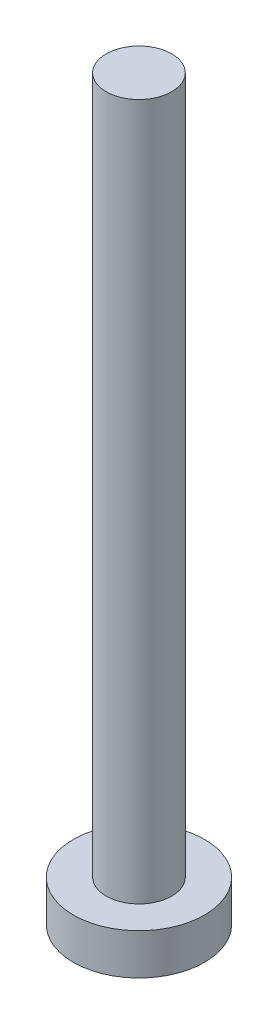
ISO-10303-21;
HEADER;
FILE_DESCRIPTION(('STEP AP214'),'2;1');
FILE_NAME('part.step','',(''),(''),'','','');
FILE_SCHEMA(('AUTOMOTIVE_DESIGN { 1 0 10303 214 1 1 1 1 }'));
ENDSEC;
DATA;
#1=APPLICATION_CONTEXT('core data for automotive mechanical design processes');
#2=APPLICATION_PROTOCOL_DEFINITION('international standard','automotive_design',2000,#1);
#3=PRODUCT_CONTEXT('',#1,'mechanical');
#4=PRODUCT('Part','Part','',(#3));
#5=PRODUCT_RELATED_PRODUCT_CATEGORY('part','',(#4));
#6=PRODUCT_DEFINITION_FORMATION('','',#4);
#7=PRODUCT_DEFINITION_CONTEXT('part definition',#1,'design');
#8=PRODUCT_DEFINITION('design','',#6,#7);
#9=PRODUCT_DEFINITION_SHAPE('','',#8);
#10=(LENGTH_UNIT() NAMED_UNIT(*) SI_UNIT(.MILLI.,.METRE.));
#11=(NAMED_UNIT(*) PLANE_ANGLE_UNIT() SI_UNIT($,.RADIAN.));
#12=(NAMED_UNIT(*) SI_UNIT($,.STERADIAN.) SOLID_ANGLE_UNIT());
#13=UNCERTAINTY_MEASURE_WITH_UNIT(LENGTH_MEASURE(1.E-05),#10,'distance_accuracy_value','');
#14=(GEOMETRIC_REPRESENTATION_CONTEXT(3) GLOBAL_UNCERTAINTY_ASSIGNED_CONTEXT((#13)) GLOBAL_UNIT_ASSIGNED_CONTEXT((#10,
#11,#12)) REPRESENTATION_CONTEXT('',''));
#15=CARTESIAN_POINT('',(0.,0.,0.));
#16=DIRECTION('',(0.,0.,1.));
#17=DIRECTION('',(1.,0.,0.));
#18=AXIS2_PLACEMENT_3D('',#15,#16,#17);
#19=CARTESIAN_POINT('',(0.,42.5,3.99999999999999));
#20=DIRECTION('',(0.,1.,0.));
#21=DIRECTION('',(0.,0.,1.));
#22=AXIS2_PLACEMENT_3D('',#19,#20,#21);
#23=PLANE('',#22);
#24=CARTESIAN_POINT('',(0.,42.5,0.));
#25=DIRECTION('',(0.,1.,0.));
#26=DIRECTION('',(0.,0.,1.));
#27=AXIS2_PLACEMENT_3D('',#24,#25,#26);
#28=CIRCLE('',#27,3.99999999999999);
#29=CARTESIAN_POINT('',(0.,42.5,3.99999999999999));
#30=VERTEX_POINT('',#29);
#31=EDGE_CURVE('E187',#30,#30,#28,.T.);
#32=ORIENTED_EDGE('',*,*,#31,.T.);
#33=EDGE_LOOP('',(#32));
#34=FACE_BOUND('',#33,.T.);
#35=ADVANCED_FACE('F33',(#34),#23,.T.);
#36=CARTESIAN_POINT('',(0.,-47.5,7.99999999999999));
#37=DIRECTION('',(0.,-1.,0.));
#38=DIRECTION('',(0.,0.,-1.));
#39=AXIS2_PLACEMENT_3D('',#36,#37,#38);
#40=PLANE('',#39);
#41=DIRECTION('',(1.,0.,0.));
#42=VECTOR('',#41,1.);
#43=CARTESIAN_POINT('',(0.,-47.5,-0.999999999999999));
#44=LINE('',#43,#42);
#45=CARTESIAN_POINT('',(-5.,-47.5,-0.999999999999998));
#46=VERTEX_POINT('',#45);
#47=CARTESIAN_POINT('',(-0.999999999999999,-47.5,-0.999999999999997));
#48=VERTEX_POINT('',#47);
#49=EDGE_CURVE('E47',#46,#48,#44,.T.);
#50=ORIENTED_EDGE('',*,*,#49,.F.);
#51=DIRECTION('',(0.,0.,-1.));
#52=VECTOR('',#51,1.);
#53=CARTESIAN_POINT('',(-5.,-47.5,0.));
#54=LINE('',#53,#52);
#55=CARTESIAN_POINT('',(-5.,-47.5,1.));
#56=VERTEX_POINT('',#55);
#57=EDGE_CURVE('E183',#56,#46,#54,.T.);
#58=ORIENTED_EDGE('',*,*,#57,.F.);
#59=DIRECTION('',(1.,0.,0.));
#60=VECTOR('',#59,1.);
#61=CARTESIAN_POINT('',(0.,-47.5,1.));
#62=LINE('',#61,#60);
#63=CARTESIAN_POINT('',(-0.999999999999999,-47.5,1.));
#64=VERTEX_POINT('',#63);
#65=EDGE_CURVE('E181',#56,#64,#62,.T.);
#66=ORIENTED_EDGE('',*,*,#65,.T.);
#67=DIRECTION('',(0.,0.,-1.));
#68=VECTOR('',#67,1.);
#69=CARTESIAN_POINT('',(-0.999999999999999,-47.5,0.));
#70=LINE('',#69,#68);
#71=CARTESIAN_POINT('',(-1.,-47.5,5.));
#72=VERTEX_POINT('',#71);
#73=EDGE_CURVE('E140',#72,#64,#70,.T.);
#74=ORIENTED_EDGE('',*,*,#73,.F.);
#75=DIRECTION('',(1.,0.,0.));
#76=VECTOR('',#75,1.);
#77=CARTESIAN_POINT('',(0.,-47.5,5.));
#78=LINE('',#77,#76);
#79=CARTESIAN_POINT('',(1.,-47.5,5.));
#80=VERTEX_POINT('',#79);
#81=EDGE_CURVE('E177',#72,#80,#78,.T.);
#82=ORIENTED_EDGE('',*,*,#81,.T.);
#83=DIRECTION('',(0.,0.,-1.));
#84=VECTOR('',#83,1.);
#85=CARTESIAN_POINT('',(1.,-47.5,0.));
#86=LINE('',#85,#84);
#87=CARTESIAN_POINT('',(1.,-47.5,1.));
#88=VERTEX_POINT('',#87);
#89=EDGE_CURVE('E174',#80,#88,#86,.T.);
#90=ORIENTED_EDGE('',*,*,#89,.T.);
#91=DIRECTION('',(1.,0.,0.));
#92=VECTOR('',#91,1.);
#93=CARTESIAN_POINT('',(0.,-47.5,1.));
#94=LINE('',#93,#92);
#95=CARTESIAN_POINT('',(5.,-47.5,1.));
#96=VERTEX_POINT('',#95);
#97=EDGE_CURVE('E171',#88,#96,#94,.T.);
#98=ORIENTED_EDGE('',*,*,#97,.T.);
#99=DIRECTION('',(0.,0.,-1.));
#100=VECTOR('',#99,1.);
#101=CARTESIAN_POINT('',(5.,-47.5,0.));
#102=LINE('',#101,#100);
#103=CARTESIAN_POINT('',(5.,-47.5,-0.999999999999998));
#104=VERTEX_POINT('',#103);
#105=EDGE_CURVE('E168',#96,#104,#102,.T.);
#106=ORIENTED_EDGE('',*,*,#105,.T.);
#107=DIRECTION('',(1.,0.,0.));
#108=VECTOR('',#107,1.);
#109=CARTESIAN_POINT('',(0.,-47.5,-0.999999999999998));
#110=LINE('',#109,#108);
#111=CARTESIAN_POINT('',(1.,-47.5,-0.999999999999998));
#112=VERTEX_POINT('',#111);
#113=EDGE_CURVE('E165',#112,#104,#110,.T.);
#114=ORIENTED_EDGE('',*,*,#113,.F.);
#115=DIRECTION('',(0.,0.,-1.));
#116=VECTOR('',#115,1.);
#117=CARTESIAN_POINT('',(1.,-47.5,0.));
#118=LINE('',#117,#116);
#119=CARTESIAN_POINT('',(1.,-47.5,-5.));
#120=VERTEX_POINT('',#119);
#121=EDGE_CURVE('E162',#112,#120,#118,.T.);
#122=ORIENTED_EDGE('',*,*,#121,.T.);
#123=DIRECTION('',(1.,0.,0.));
#124=VECTOR('',#123,1.);
#125=CARTESIAN_POINT('',(0.,-47.5,-5.));
#126=LINE('',#125,#124);
#127=CARTESIAN_POINT('',(-0.999999999999998,-47.5,-5.));
#128=VERTEX_POINT('',#127);
#129=EDGE_CURVE('E159',#128,#120,#126,.T.);
#130=ORIENTED_EDGE('',*,*,#129,.F.);
#131=DIRECTION('',(0.,0.,-1.));
#132=VECTOR('',#131,1.);
#133=CARTESIAN_POINT('',(-0.999999999999999,-47.5,0.));
#134=LINE('',#133,#132);
#135=EDGE_CURVE('E156',#48,#128,#134,.T.);
#136=ORIENTED_EDGE('',*,*,#135,.F.);
#137=EDGE_LOOP('',(#50,#58,#66,#74,#82,#90,#98,#106,#114,#122,#130,#136));
#138=FACE_BOUND('',#137,.T.);
#139=CARTESIAN_POINT('',(0.,-47.5,0.));
#140=DIRECTION('',(0.,1.,0.));
#141=DIRECTION('',(0.,0.,1.));
#142=AXIS2_PLACEMENT_3D('',#139,#140,#141);
#143=CIRCLE('',#142,7.99999999999999);
#144=CARTESIAN_POINT('',(0.,-47.5,7.99999999999999));
#145=VERTEX_POINT('',#144);
#146=EDGE_CURVE('E11',#145,#145,#143,.T.);
#147=ORIENTED_EDGE('',*,*,#146,.F.);
#148=EDGE_LOOP('',(#147));
#149=FACE_BOUND('',#148,.T.);
#150=ADVANCED_FACE('F217',(#138,#149),#40,.T.);
#151=CARTESIAN_POINT('',(0.,13.7456465212145,0.));
#152=DIRECTION('',(0.,1.,0.));
#153=DIRECTION('',(0.,0.,1.));
#154=AXIS2_PLACEMENT_3D('',#151,#152,#153);
#155=CYLINDRICAL_SURFACE('',#154,7.99999999999999);
#156=ORIENTED_EDGE('',*,*,#146,.T.);
#157=EDGE_LOOP('',(#156));
#158=FACE_BOUND('',#157,.T.);
#159=CARTESIAN_POINT('',(0.,-42.5,0.));
#160=DIRECTION('',(0.,1.,0.));
#161=DIRECTION('',(0.,0.,1.));
#162=AXIS2_PLACEMENT_3D('',#159,#160,#161);
#163=CIRCLE('',#162,7.99999999999999);
#164=CARTESIAN_POINT('',(0.,-42.5,7.99999999999999));
#165=VERTEX_POINT('',#164);
#166=EDGE_CURVE('E40',#165,#165,#163,.T.);
#167=ORIENTED_EDGE('',*,*,#166,.F.);
#168=EDGE_LOOP('',(#167));
#169=FACE_BOUND('',#168,.T.);
#170=ADVANCED_FACE('F215',(#158,#169),#155,.T.);
#171=CARTESIAN_POINT('',(0.,-42.5,3.99999999999999));
#172=DIRECTION('',(0.,1.,0.));
#173=DIRECTION('',(0.,0.,1.));
#174=AXIS2_PLACEMENT_3D('',#171,#172,#173);
#175=PLANE('',#174);
#176=ORIENTED_EDGE('',*,*,#166,.T.);
#177=EDGE_LOOP('',(#176));
#178=FACE_BOUND('',#177,.T.);
#179=CARTESIAN_POINT('',(0.,-42.5,0.));
#180=DIRECTION('',(0.,1.,0.));
#181=DIRECTION('',(0.,0.,1.));
#182=AXIS2_PLACEMENT_3D('',#179,#180,#181);
#183=CIRCLE('',#182,3.99999999999999);
#184=CARTESIAN_POINT('',(0.,-42.5,3.99999999999999));
#185=VERTEX_POINT('',#184);
#186=EDGE_CURVE('E207',#185,#185,#183,.T.);
#187=ORIENTED_EDGE('',*,*,#186,.F.);
#188=EDGE_LOOP('',(#187));
#189=FACE_BOUND('',#188,.T.);
#190=ADVANCED_FACE('F212',(#178,#189),#175,.T.);
#191=CARTESIAN_POINT('',(0.,13.7456465212145,0.));
#192=DIRECTION('',(0.,1.,0.));
#193=DIRECTION('',(0.,0.,1.));
#194=AXIS2_PLACEMENT_3D('',#191,#192,#193);
#195=CYLINDRICAL_SURFACE('',#194,3.99999999999999);
#196=ORIENTED_EDGE('',*,*,#186,.T.);
#197=EDGE_LOOP('',(#196));
#198=FACE_BOUND('',#197,.T.);
#199=ORIENTED_EDGE('',*,*,#31,.F.);
#200=EDGE_LOOP('',(#199));
#201=FACE_BOUND('',#200,.T.);
#202=ADVANCED_FACE('F224',(#198,#201),#195,.T.);
#203=CARTESIAN_POINT('',(0.,-45.5,-0.999999999999999));
#204=DIRECTION('',(0.,0.,-1.));
#205=DIRECTION('',(-1.,0.,0.));
#206=AXIS2_PLACEMENT_3D('',#203,#204,#205);
#207=PLANE('',#206);
#208=ORIENTED_EDGE('',*,*,#49,.T.);
#209=DIRECTION('',(0.,-1.,0.));
#210=VECTOR('',#209,1.);
#211=CARTESIAN_POINT('',(-0.999999999999999,-45.5,-0.999999999999999));
#212=LINE('',#211,#210);
#213=CARTESIAN_POINT('',(-0.999999999999999,-45.5,-0.999999999999999));
#214=VERTEX_POINT('',#213);
#215=EDGE_CURVE('E95',#214,#48,#212,.T.);
#216=ORIENTED_EDGE('',*,*,#215,.F.);
#217=DIRECTION('',(1.,0.,0.));
#218=VECTOR('',#217,1.);
#219=CARTESIAN_POINT('',(0.,-45.5,-0.999999999999999));
#220=LINE('',#219,#218);
#221=CARTESIAN_POINT('',(-5.,-45.5,-0.999999999999998));
#222=VERTEX_POINT('',#221);
#223=EDGE_CURVE('E185',#222,#214,#220,.T.);
#224=ORIENTED_EDGE('',*,*,#223,.F.);
#225=DIRECTION('',(0.,-1.,0.));
#226=VECTOR('',#225,1.);
#227=CARTESIAN_POINT('',(-5.,-45.5,-0.999999999999998));
#228=LINE('',#227,#226);
#229=EDGE_CURVE('E55',#222,#46,#228,.T.);
#230=ORIENTED_EDGE('',*,*,#229,.T.);
#231=EDGE_LOOP('',(#208,#216,#224,#230));
#232=FACE_BOUND('',#231,.T.);
#233=ADVANCED_FACE('F234',(#232),#207,.F.);
#234=CARTESIAN_POINT('',(-5.,-45.5,0.));
#235=DIRECTION('',(-1.,0.,0.));
#236=DIRECTION('',(0.,0.,1.));
#237=AXIS2_PLACEMENT_3D('',#234,#235,#236);
#238=PLANE('',#237);
#239=ORIENTED_EDGE('',*,*,#57,.T.);
#240=ORIENTED_EDGE('',*,*,#229,.F.);
#241=DIRECTION('',(0.,0.,-1.));
#242=VECTOR('',#241,1.);
#243=CARTESIAN_POINT('',(-5.,-45.5,0.));
#244=LINE('',#243,#242);
#245=CARTESIAN_POINT('',(-5.,-45.5,1.));
#246=VERTEX_POINT('',#245);
#247=EDGE_CURVE('E133',#246,#222,#244,.T.);
#248=ORIENTED_EDGE('',*,*,#247,.F.);
#249=DIRECTION('',(0.,-1.,0.));
#250=VECTOR('',#249,1.);
#251=CARTESIAN_POINT('',(-5.,-45.5,1.));
#252=LINE('',#251,#250);
#253=EDGE_CURVE('E129',#246,#56,#252,.T.);
#254=ORIENTED_EDGE('',*,*,#253,.T.);
#255=EDGE_LOOP('',(#239,#240,#248,#254));
#256=FACE_BOUND('',#255,.T.);
#257=ADVANCED_FACE('F240',(#256),#238,.F.);
#258=CARTESIAN_POINT('',(0.,-45.5,1.));
#259=DIRECTION('',(0.,0.,-1.));
#260=DIRECTION('',(-1.,0.,0.));
#261=AXIS2_PLACEMENT_3D('',#258,#259,#260);
#262=PLANE('',#261);
#263=ORIENTED_EDGE('',*,*,#65,.F.);
#264=ORIENTED_EDGE('',*,*,#253,.F.);
#265=DIRECTION('',(1.,0.,0.));
#266=VECTOR('',#265,1.);
#267=CARTESIAN_POINT('',(0.,-45.5,1.));
#268=LINE('',#267,#266);
#269=CARTESIAN_POINT('',(-0.999999999999999,-45.5,1.));
#270=VERTEX_POINT('',#269);
#271=EDGE_CURVE('E123',#246,#270,#268,.T.);
#272=ORIENTED_EDGE('',*,*,#271,.T.);
#273=DIRECTION('',(0.,-1.,0.));
#274=VECTOR('',#273,1.);
#275=CARTESIAN_POINT('',(-0.999999999999999,-45.5,1.));
#276=LINE('',#275,#274);
#277=EDGE_CURVE('E127',#270,#64,#276,.T.);
#278=ORIENTED_EDGE('',*,*,#277,.T.);
#279=EDGE_LOOP('',(#263,#264,#272,#278));
#280=FACE_BOUND('',#279,.T.);
#281=ADVANCED_FACE('F126',(#280),#262,.T.);
#282=CARTESIAN_POINT('',(-0.999999999999999,-45.5,0.));
#283=DIRECTION('',(-1.,0.,0.));
#284=DIRECTION('',(0.,0.,1.));
#285=AXIS2_PLACEMENT_3D('',#282,#283,#284);
#286=PLANE('',#285);
#287=ORIENTED_EDGE('',*,*,#73,.T.);
#288=ORIENTED_EDGE('',*,*,#277,.F.);
#289=DIRECTION('',(0.,0.,-1.));
#290=VECTOR('',#289,1.);
#291=CARTESIAN_POINT('',(-0.999999999999999,-45.5,0.));
#292=LINE('',#291,#290);
#293=CARTESIAN_POINT('',(-1.,-45.5,5.));
#294=VERTEX_POINT('',#293);
#295=EDGE_CURVE('E134',#294,#270,#292,.T.);
#296=ORIENTED_EDGE('',*,*,#295,.F.);
#297=DIRECTION('',(0.,-1.,0.));
#298=VECTOR('',#297,1.);
#299=CARTESIAN_POINT('',(-1.,-45.5,5.));
#300=LINE('',#299,#298);
#301=EDGE_CURVE('E142',#294,#72,#300,.T.);
#302=ORIENTED_EDGE('',*,*,#301,.T.);
#303=EDGE_LOOP('',(#287,#288,#296,#302));
#304=FACE_BOUND('',#303,.T.);
#305=ADVANCED_FACE('F138',(#304),#286,.F.);
#306=CARTESIAN_POINT('',(0.,-45.5,5.));
#307=DIRECTION('',(0.,0.,-1.));
#308=DIRECTION('',(-1.,0.,0.));
#309=AXIS2_PLACEMENT_3D('',#306,#307,#308);
#310=PLANE('',#309);
#311=ORIENTED_EDGE('',*,*,#81,.F.);
#312=ORIENTED_EDGE('',*,*,#301,.F.);
#313=DIRECTION('',(1.,0.,0.));
#314=VECTOR('',#313,1.);
#315=CARTESIAN_POINT('',(0.,-45.5,5.));
#316=LINE('',#315,#314);
#317=CARTESIAN_POINT('',(1.,-45.5,5.));
#318=VERTEX_POINT('',#317);
#319=EDGE_CURVE('E148',#294,#318,#316,.T.);
#320=ORIENTED_EDGE('',*,*,#319,.T.);
#321=DIRECTION('',(0.,-1.,0.));
#322=VECTOR('',#321,1.);
#323=CARTESIAN_POINT('',(1.,-45.5,5.));
#324=LINE('',#323,#322);
#325=EDGE_CURVE('E190',#318,#80,#324,.T.);
#326=ORIENTED_EDGE('',*,*,#325,.T.);
#327=EDGE_LOOP('',(#311,#312,#320,#326));
#328=FACE_BOUND('',#327,.T.);
#329=ADVANCED_FACE('F270',(#328),#310,.T.);
#330=CARTESIAN_POINT('',(1.,-45.5,0.));
#331=DIRECTION('',(-1.,0.,0.));
#332=DIRECTION('',(0.,0.,1.));
#333=AXIS2_PLACEMENT_3D('',#330,#331,#332);
#334=PLANE('',#333);
#335=ORIENTED_EDGE('',*,*,#89,.F.);
#336=ORIENTED_EDGE('',*,*,#325,.F.);
#337=DIRECTION('',(0.,0.,-1.));
#338=VECTOR('',#337,1.);
#339=CARTESIAN_POINT('',(1.,-45.5,0.));
#340=LINE('',#339,#338);
#341=CARTESIAN_POINT('',(1.,-45.5,1.));
#342=VERTEX_POINT('',#341);
#343=EDGE_CURVE('E150',#318,#342,#340,.T.);
#344=ORIENTED_EDGE('',*,*,#343,.T.);
#345=DIRECTION('',(0.,-1.,0.));
#346=VECTOR('',#345,1.);
#347=CARTESIAN_POINT('',(1.,-45.5,1.));
#348=LINE('',#347,#346);
#349=EDGE_CURVE('E192',#342,#88,#348,.T.);
#350=ORIENTED_EDGE('',*,*,#349,.T.);
#351=EDGE_LOOP('',(#335,#336,#344,#350));
#352=FACE_BOUND('',#351,.T.);
#353=ADVANCED_FACE('F266',(#352),#334,.T.);
#354=CARTESIAN_POINT('',(0.,-45.5,1.));
#355=DIRECTION('',(0.,0.,-1.));
#356=DIRECTION('',(-1.,0.,0.));
#357=AXIS2_PLACEMENT_3D('',#354,#355,#356);
#358=PLANE('',#357);
#359=ORIENTED_EDGE('',*,*,#97,.F.);
#360=ORIENTED_EDGE('',*,*,#349,.F.);
#361=DIRECTION('',(1.,0.,0.));
#362=VECTOR('',#361,1.);
#363=CARTESIAN_POINT('',(0.,-45.5,1.));
#364=LINE('',#363,#362);
#365=CARTESIAN_POINT('',(5.,-45.5,1.));
#366=VERTEX_POINT('',#365);
#367=EDGE_CURVE('E404',#342,#366,#364,.T.);
#368=ORIENTED_EDGE('',*,*,#367,.T.);
#369=DIRECTION('',(0.,-1.,0.));
#370=VECTOR('',#369,1.);
#371=CARTESIAN_POINT('',(5.,-45.5,1.));
#372=LINE('',#371,#370);
#373=EDGE_CURVE('E194',#366,#96,#372,.T.);
#374=ORIENTED_EDGE('',*,*,#373,.T.);
#375=EDGE_LOOP('',(#359,#360,#368,#374));
#376=FACE_BOUND('',#375,.T.);
#377=ADVANCED_FACE('F262',(#376),#358,.T.);
#378=CARTESIAN_POINT('',(5.,-45.5,0.));
#379=DIRECTION('',(-1.,0.,0.));
#380=DIRECTION('',(0.,0.,1.));
#381=AXIS2_PLACEMENT_3D('',#378,#379,#380);
#382=PLANE('',#381);
#383=ORIENTED_EDGE('',*,*,#105,.F.);
#384=ORIENTED_EDGE('',*,*,#373,.F.);
#385=DIRECTION('',(0.,0.,-1.));
#386=VECTOR('',#385,1.);
#387=CARTESIAN_POINT('',(5.,-45.5,0.));
#388=LINE('',#387,#386);
#389=CARTESIAN_POINT('',(5.,-45.5,-0.999999999999998));
#390=VERTEX_POINT('',#389);
#391=EDGE_CURVE('E402',#366,#390,#388,.T.);
#392=ORIENTED_EDGE('',*,*,#391,.T.);
#393=DIRECTION('',(0.,-1.,0.));
#394=VECTOR('',#393,1.);
#395=CARTESIAN_POINT('',(5.,-45.5,-0.999999999999998));
#396=LINE('',#395,#394);
#397=EDGE_CURVE('E196',#390,#104,#396,.T.);
#398=ORIENTED_EDGE('',*,*,#397,.T.);
#399=EDGE_LOOP('',(#383,#384,#392,#398));
#400=FACE_BOUND('',#399,.T.);
#401=ADVANCED_FACE('F258',(#400),#382,.T.);
#402=CARTESIAN_POINT('',(0.,-45.5,-0.999999999999998));
#403=DIRECTION('',(0.,0.,-1.));
#404=DIRECTION('',(-1.,0.,0.));
#405=AXIS2_PLACEMENT_3D('',#402,#403,#404);
#406=PLANE('',#405);
#407=ORIENTED_EDGE('',*,*,#113,.T.);
#408=ORIENTED_EDGE('',*,*,#397,.F.);
#409=DIRECTION('',(1.,0.,0.));
#410=VECTOR('',#409,1.);
#411=CARTESIAN_POINT('',(0.,-45.5,-0.999999999999998));
#412=LINE('',#411,#410);
#413=CARTESIAN_POINT('',(1.,-45.5,-0.999999999999998));
#414=VERTEX_POINT('',#413);
#415=EDGE_CURVE('E399',#414,#390,#412,.T.);
#416=ORIENTED_EDGE('',*,*,#415,.F.);
#417=DIRECTION('',(0.,-1.,0.));
#418=VECTOR('',#417,1.);
#419=CARTESIAN_POINT('',(1.,-45.5,-0.999999999999998));
#420=LINE('',#419,#418);
#421=EDGE_CURVE('E198',#414,#112,#420,.T.);
#422=ORIENTED_EDGE('',*,*,#421,.T.);
#423=EDGE_LOOP('',(#407,#408,#416,#422));
#424=FACE_BOUND('',#423,.T.);
#425=ADVANCED_FACE('F254',(#424),#406,.F.);
#426=CARTESIAN_POINT('',(1.,-45.5,0.));
#427=DIRECTION('',(-1.,0.,0.));
#428=DIRECTION('',(0.,0.,1.));
#429=AXIS2_PLACEMENT_3D('',#426,#427,#428);
#430=PLANE('',#429);
#431=ORIENTED_EDGE('',*,*,#121,.F.);
#432=ORIENTED_EDGE('',*,*,#421,.F.);
#433=DIRECTION('',(0.,0.,-1.));
#434=VECTOR('',#433,1.);
#435=CARTESIAN_POINT('',(1.,-45.5,0.));
#436=LINE('',#435,#434);
#437=CARTESIAN_POINT('',(1.,-45.5,-5.));
#438=VERTEX_POINT('',#437);
#439=EDGE_CURVE('E397',#414,#438,#436,.T.);
#440=ORIENTED_EDGE('',*,*,#439,.T.);
#441=DIRECTION('',(0.,-1.,0.));
#442=VECTOR('',#441,1.);
#443=CARTESIAN_POINT('',(1.,-45.5,-5.));
#444=LINE('',#443,#442);
#445=EDGE_CURVE('E200',#438,#120,#444,.T.);
#446=ORIENTED_EDGE('',*,*,#445,.T.);
#447=EDGE_LOOP('',(#431,#432,#440,#446));
#448=FACE_BOUND('',#447,.T.);
#449=ADVANCED_FACE('F250',(#448),#430,.T.);
#450=CARTESIAN_POINT('',(0.,-45.5,-5.));
#451=DIRECTION('',(0.,0.,-1.));
#452=DIRECTION('',(-1.,0.,0.));
#453=AXIS2_PLACEMENT_3D('',#450,#451,#452);
#454=PLANE('',#453);
#455=ORIENTED_EDGE('',*,*,#129,.T.);
#456=ORIENTED_EDGE('',*,*,#445,.F.);
#457=DIRECTION('',(1.,0.,0.));
#458=VECTOR('',#457,1.);
#459=CARTESIAN_POINT('',(0.,-45.5,-5.));
#460=LINE('',#459,#458);
#461=CARTESIAN_POINT('',(-0.999999999999998,-45.5,-5.));
#462=VERTEX_POINT('',#461);
#463=EDGE_CURVE('E392',#462,#438,#460,.T.);
#464=ORIENTED_EDGE('',*,*,#463,.F.);
#465=DIRECTION('',(0.,-1.,0.));
#466=VECTOR('',#465,1.);
#467=CARTESIAN_POINT('',(-0.999999999999998,-45.5,-5.));
#468=LINE('',#467,#466);
#469=EDGE_CURVE('E202',#462,#128,#468,.T.);
#470=ORIENTED_EDGE('',*,*,#469,.T.);
#471=EDGE_LOOP('',(#455,#456,#464,#470));
#472=FACE_BOUND('',#471,.T.);
#473=ADVANCED_FACE('F246',(#472),#454,.F.);
#474=CARTESIAN_POINT('',(-0.999999999999999,-45.5,0.));
#475=DIRECTION('',(-1.,0.,0.));
#476=DIRECTION('',(0.,0.,1.));
#477=AXIS2_PLACEMENT_3D('',#474,#475,#476);
#478=PLANE('',#477);
#479=ORIENTED_EDGE('',*,*,#135,.T.);
#480=ORIENTED_EDGE('',*,*,#469,.F.);
#481=DIRECTION('',(0.,0.,-1.));
#482=VECTOR('',#481,1.);
#483=CARTESIAN_POINT('',(-0.999999999999999,-45.5,0.));
#484=LINE('',#483,#482);
#485=EDGE_CURVE('E390',#214,#462,#484,.T.);
#486=ORIENTED_EDGE('',*,*,#485,.F.);
#487=ORIENTED_EDGE('',*,*,#215,.T.);
#488=EDGE_LOOP('',(#479,#480,#486,#487));
#489=FACE_BOUND('',#488,.T.);
#490=ADVANCED_FACE('F243',(#489),#478,.F.);
#491=CARTESIAN_POINT('',(0.,-45.5,0.));
#492=DIRECTION('',(0.,-1.,0.));
#493=DIRECTION('',(0.,0.,-1.));
#494=AXIS2_PLACEMENT_3D('',#491,#492,#493);
#495=PLANE('',#494);
#496=ORIENTED_EDGE('',*,*,#223,.T.);
#497=ORIENTED_EDGE('',*,*,#485,.T.);
#498=ORIENTED_EDGE('',*,*,#463,.T.);
#499=ORIENTED_EDGE('',*,*,#439,.F.);
#500=ORIENTED_EDGE('',*,*,#415,.T.);
#501=ORIENTED_EDGE('',*,*,#391,.F.);
#502=ORIENTED_EDGE('',*,*,#367,.F.);
#503=ORIENTED_EDGE('',*,*,#343,.F.);
#504=ORIENTED_EDGE('',*,*,#319,.F.);
#505=ORIENTED_EDGE('',*,*,#295,.T.);
#506=ORIENTED_EDGE('',*,*,#271,.F.);
#507=ORIENTED_EDGE('',*,*,#247,.T.);
#508=EDGE_LOOP('',(#496,#497,#498,#499,#500,#501,#502,#503,#504,#505,#506,#507));
#509=FACE_BOUND('',#508,.T.);
#510=ADVANCED_FACE('F146',(#509),#495,.T.);
#511=CLOSED_SHELL('',(#35,#150,#170,#190,#202,#233,#257,#281,#305,#329,#353,#377,#401,#425,#449,
#473,#490,#510));
#512=MANIFOLD_SOLID_BREP('B2',#511);
#513=ADVANCED_BREP_SHAPE_REPRESENTATION('',(#18,#512),#14);
#514=SHAPE_DEFINITION_REPRESENTATION(#9,#513);
ENDSEC;
END-ISO-10303-21;
